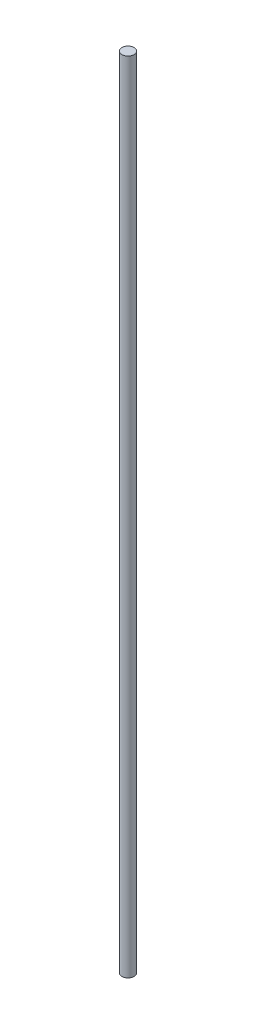
ISO-10303-21;
HEADER;
FILE_DESCRIPTION(('STEP AP214'),'2;1');
FILE_NAME('part.step','',(''),(''),'','','');
FILE_SCHEMA(('AUTOMOTIVE_DESIGN { 1 0 10303 214 1 1 1 1 }'));
ENDSEC;
DATA;
#1=APPLICATION_CONTEXT('core data for automotive mechanical design processes');
#2=APPLICATION_PROTOCOL_DEFINITION('international standard','automotive_design',2000,#1);
#3=PRODUCT_CONTEXT('',#1,'mechanical');
#4=PRODUCT('Part','Part','',(#3));
#5=PRODUCT_RELATED_PRODUCT_CATEGORY('part','',(#4));
#6=PRODUCT_DEFINITION_FORMATION('','',#4);
#7=PRODUCT_DEFINITION_CONTEXT('part definition',#1,'design');
#8=PRODUCT_DEFINITION('design','',#6,#7);
#9=PRODUCT_DEFINITION_SHAPE('','',#8);
#10=(LENGTH_UNIT() NAMED_UNIT(*) SI_UNIT(.MILLI.,.METRE.));
#11=(NAMED_UNIT(*) PLANE_ANGLE_UNIT() SI_UNIT($,.RADIAN.));
#12=(NAMED_UNIT(*) SI_UNIT($,.STERADIAN.) SOLID_ANGLE_UNIT());
#13=UNCERTAINTY_MEASURE_WITH_UNIT(LENGTH_MEASURE(1.E-05),#10,'distance_accuracy_value','');
#14=(GEOMETRIC_REPRESENTATION_CONTEXT(3) GLOBAL_UNCERTAINTY_ASSIGNED_CONTEXT((#13)) GLOBAL_UNIT_ASSIGNED_CONTEXT((#10,
#11,#12)) REPRESENTATION_CONTEXT('',''));
#15=CARTESIAN_POINT('',(0.,0.,0.));
#16=DIRECTION('',(0.,0.,1.));
#17=DIRECTION('',(1.,0.,0.));
#18=AXIS2_PLACEMENT_3D('',#15,#16,#17);
#19=CARTESIAN_POINT('',(0.,130.,0.));
#20=DIRECTION('',(0.,-1.,0.));
#21=DIRECTION('',(0.,0.,-1.));
#22=AXIS2_PLACEMENT_3D('',#19,#20,#21);
#23=CYLINDRICAL_SURFACE('',#22,1.);
#24=CARTESIAN_POINT('',(0.,130.,0.));
#25=DIRECTION('',(0.,1.,0.));
#26=DIRECTION('',(0.,0.,1.));
#27=AXIS2_PLACEMENT_3D('',#24,#25,#26);
#28=CIRCLE('',#27,1.);
#29=CARTESIAN_POINT('',(0.,130.,1.));
#30=VERTEX_POINT('',#29);
#31=EDGE_CURVE('E10',#30,#30,#28,.T.);
#32=ORIENTED_EDGE('',*,*,#31,.F.);
#33=EDGE_LOOP('',(#32));
#34=FACE_BOUND('',#33,.T.);
#35=CARTESIAN_POINT('',(0.,0.,0.));
#36=DIRECTION('',(0.,1.,0.));
#37=DIRECTION('',(0.,0.,1.));
#38=AXIS2_PLACEMENT_3D('',#35,#36,#37);
#39=CIRCLE('',#38,1.);
#40=CARTESIAN_POINT('',(0.,0.,1.));
#41=VERTEX_POINT('',#40);
#42=EDGE_CURVE('E34',#41,#41,#39,.T.);
#43=ORIENTED_EDGE('',*,*,#42,.T.);
#44=EDGE_LOOP('',(#43));
#45=FACE_BOUND('',#44,.T.);
#46=ADVANCED_FACE('F31',(#34,#45),#23,.T.);
#47=CARTESIAN_POINT('',(0.,130.,0.));
#48=DIRECTION('',(0.,1.,0.));
#49=DIRECTION('',(0.,0.,1.));
#50=AXIS2_PLACEMENT_3D('',#47,#48,#49);
#51=PLANE('',#50);
#52=ORIENTED_EDGE('',*,*,#31,.T.);
#53=EDGE_LOOP('',(#52));
#54=FACE_BOUND('',#53,.T.);
#55=ADVANCED_FACE('F46',(#54),#51,.T.);
#56=CARTESIAN_POINT('',(0.,0.,0.));
#57=DIRECTION('',(0.,1.,0.));
#58=DIRECTION('',(0.,0.,1.));
#59=AXIS2_PLACEMENT_3D('',#56,#57,#58);
#60=PLANE('',#59);
#61=ORIENTED_EDGE('',*,*,#42,.F.);
#62=EDGE_LOOP('',(#61));
#63=FACE_BOUND('',#62,.T.);
#64=ADVANCED_FACE('F44',(#63),#60,.F.);
#65=CLOSED_SHELL('',(#46,#55,#64));
#66=MANIFOLD_SOLID_BREP('B2',#65);
#67=ADVANCED_BREP_SHAPE_REPRESENTATION('',(#18,#66),#14);
#68=SHAPE_DEFINITION_REPRESENTATION(#9,#67);
ENDSEC;
END-ISO-10303-21;
